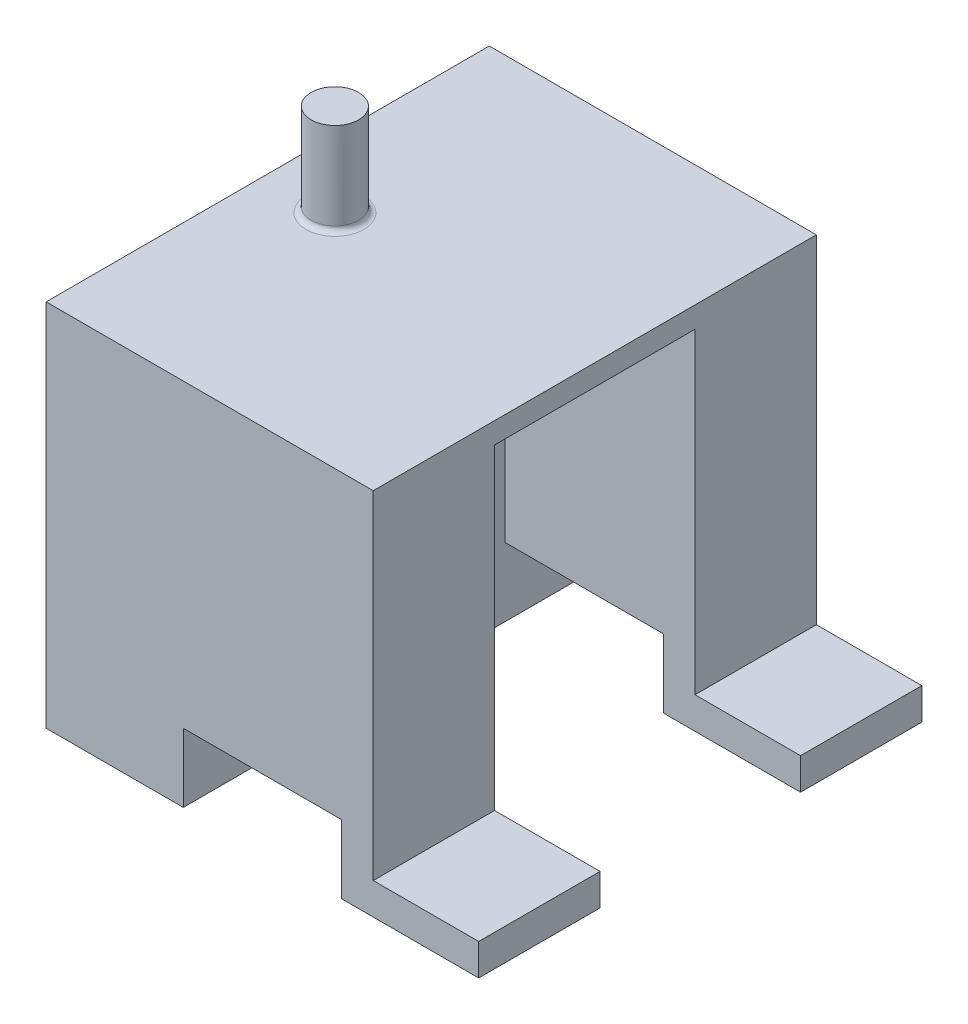
ISO-10303-21;
HEADER;
FILE_DESCRIPTION(('STEP AP214'),'2;1');
FILE_NAME('part.step','',(''),(''),'','','');
FILE_SCHEMA(('AUTOMOTIVE_DESIGN { 1 0 10303 214 1 1 1 1 }'));
ENDSEC;
DATA;
#1=APPLICATION_CONTEXT('core data for automotive mechanical design processes');
#2=APPLICATION_PROTOCOL_DEFINITION('international standard','automotive_design',2000,#1);
#3=PRODUCT_CONTEXT('',#1,'mechanical');
#4=PRODUCT('Part','Part','',(#3));
#5=PRODUCT_RELATED_PRODUCT_CATEGORY('part','',(#4));
#6=PRODUCT_DEFINITION_FORMATION('','',#4);
#7=PRODUCT_DEFINITION_CONTEXT('part definition',#1,'design');
#8=PRODUCT_DEFINITION('design','',#6,#7);
#9=PRODUCT_DEFINITION_SHAPE('','',#8);
#10=(LENGTH_UNIT() NAMED_UNIT(*) SI_UNIT(.MILLI.,.METRE.));
#11=(NAMED_UNIT(*) PLANE_ANGLE_UNIT() SI_UNIT($,.RADIAN.));
#12=(NAMED_UNIT(*) SI_UNIT($,.STERADIAN.) SOLID_ANGLE_UNIT());
#13=UNCERTAINTY_MEASURE_WITH_UNIT(LENGTH_MEASURE(1.E-05),#10,'distance_accuracy_value','');
#14=(GEOMETRIC_REPRESENTATION_CONTEXT(3) GLOBAL_UNCERTAINTY_ASSIGNED_CONTEXT((#13)) GLOBAL_UNIT_ASSIGNED_CONTEXT((#10,
#11,#12)) REPRESENTATION_CONTEXT('',''));
#15=CARTESIAN_POINT('',(0.,0.,0.));
#16=DIRECTION('',(0.,0.,1.));
#17=DIRECTION('',(1.,0.,0.));
#18=AXIS2_PLACEMENT_3D('',#15,#16,#17);
#19=CARTESIAN_POINT('',(19.5806451612903,0.,42.));
#20=DIRECTION('',(0.,1.,0.));
#21=DIRECTION('',(0.,0.,1.));
#22=AXIS2_PLACEMENT_3D('',#19,#20,#21);
#23=PLANE('',#22);
#24=DIRECTION('',(0.,0.,-1.));
#25=VECTOR('',#24,1.);
#26=CARTESIAN_POINT('',(19.5806451612903,0.,42.));
#27=LINE('',#26,#25);
#28=CARTESIAN_POINT('',(19.5806451612903,0.,42.));
#29=VERTEX_POINT('',#28);
#30=CARTESIAN_POINT('',(19.5806451612903,0.,30.5));
#31=VERTEX_POINT('',#30);
#32=EDGE_CURVE('E211',#29,#31,#27,.T.);
#33=ORIENTED_EDGE('',*,*,#32,.T.);
#34=DIRECTION('',(1.,0.,0.));
#35=VECTOR('',#34,1.);
#36=CARTESIAN_POINT('',(-33.4982203680293,0.,30.5));
#37=LINE('',#36,#35);
#38=CARTESIAN_POINT('',(32.5806451612903,0.,30.5));
#39=VERTEX_POINT('',#38);
#40=EDGE_CURVE('E410',#31,#39,#37,.T.);
#41=ORIENTED_EDGE('',*,*,#40,.T.);
#42=DIRECTION('',(0.,0.,-1.));
#43=VECTOR('',#42,1.);
#44=CARTESIAN_POINT('',(32.5806451612903,0.,42.));
#45=LINE('',#44,#43);
#46=CARTESIAN_POINT('',(32.5806451612903,0.,42.));
#47=VERTEX_POINT('',#46);
#48=EDGE_CURVE('E243',#47,#39,#45,.T.);
#49=ORIENTED_EDGE('',*,*,#48,.F.);
#50=DIRECTION('',(1.,0.,0.));
#51=VECTOR('',#50,1.);
#52=CARTESIAN_POINT('',(19.5806451612903,0.,42.));
#53=LINE('',#52,#51);
#54=EDGE_CURVE('E210',#29,#47,#53,.T.);
#55=ORIENTED_EDGE('',*,*,#54,.F.);
#56=EDGE_LOOP('',(#33,#41,#49,#55));
#57=FACE_BOUND('',#56,.T.);
#58=ADVANCED_FACE('F41',(#57),#23,.F.);
#59=CARTESIAN_POINT('',(32.5806451612903,0.,42.));
#60=DIRECTION('',(-1.,0.,0.));
#61=DIRECTION('',(0.,0.,1.));
#62=AXIS2_PLACEMENT_3D('',#59,#60,#61);
#63=PLANE('',#62);
#64=ORIENTED_EDGE('',*,*,#48,.T.);
#65=DIRECTION('',(0.,-1.,0.));
#66=VECTOR('',#65,1.);
#67=CARTESIAN_POINT('',(32.5806451612903,0.,30.5));
#68=LINE('',#67,#66);
#69=CARTESIAN_POINT('',(32.5806451612903,3.,30.5));
#70=VERTEX_POINT('',#69);
#71=EDGE_CURVE('E420',#70,#39,#68,.T.);
#72=ORIENTED_EDGE('',*,*,#71,.F.);
#73=DIRECTION('',(0.,0.,-1.));
#74=VECTOR('',#73,1.);
#75=CARTESIAN_POINT('',(32.5806451612903,3.,42.));
#76=LINE('',#75,#74);
#77=CARTESIAN_POINT('',(32.5806451612903,3.,42.));
#78=VERTEX_POINT('',#77);
#79=EDGE_CURVE('E238',#78,#70,#76,.T.);
#80=ORIENTED_EDGE('',*,*,#79,.F.);
#81=DIRECTION('',(0.,1.,0.));
#82=VECTOR('',#81,1.);
#83=CARTESIAN_POINT('',(32.5806451612903,0.,42.));
#84=LINE('',#83,#82);
#85=EDGE_CURVE('E115',#47,#78,#84,.T.);
#86=ORIENTED_EDGE('',*,*,#85,.F.);
#87=EDGE_LOOP('',(#64,#72,#80,#86));
#88=FACE_BOUND('',#87,.T.);
#89=ADVANCED_FACE('F273',(#88),#63,.F.);
#90=CARTESIAN_POINT('',(32.5806451612903,3.,42.));
#91=DIRECTION('',(0.,-1.,0.));
#92=DIRECTION('',(1.,0.,0.));
#93=AXIS2_PLACEMENT_3D('',#90,#91,#92);
#94=PLANE('',#93);
#95=ORIENTED_EDGE('',*,*,#79,.T.);
#96=DIRECTION('',(-1.,0.,0.));
#97=VECTOR('',#96,1.);
#98=CARTESIAN_POINT('',(32.5806451612903,3.,30.5));
#99=LINE('',#98,#97);
#100=CARTESIAN_POINT('',(22.5806451612903,3.,30.5));
#101=VERTEX_POINT('',#100);
#102=EDGE_CURVE('E176',#70,#101,#99,.T.);
#103=ORIENTED_EDGE('',*,*,#102,.T.);
#104=DIRECTION('',(0.,0.,-1.));
#105=VECTOR('',#104,1.);
#106=CARTESIAN_POINT('',(22.5806451612903,3.,42.));
#107=LINE('',#106,#105);
#108=CARTESIAN_POINT('',(22.5806451612903,3.,42.));
#109=VERTEX_POINT('',#108);
#110=EDGE_CURVE('E233',#109,#101,#107,.T.);
#111=ORIENTED_EDGE('',*,*,#110,.F.);
#112=DIRECTION('',(-1.,0.,0.));
#113=VECTOR('',#112,1.);
#114=CARTESIAN_POINT('',(32.5806451612903,3.,42.));
#115=LINE('',#114,#113);
#116=EDGE_CURVE('E355',#78,#109,#115,.T.);
#117=ORIENTED_EDGE('',*,*,#116,.F.);
#118=EDGE_LOOP('',(#95,#103,#111,#117));
#119=FACE_BOUND('',#118,.T.);
#120=ADVANCED_FACE('F279',(#119),#94,.F.);
#121=CARTESIAN_POINT('',(19.5806451612903,6.5,42.));
#122=DIRECTION('',(0.,1.,0.));
#123=DIRECTION('',(-1.,0.,0.));
#124=AXIS2_PLACEMENT_3D('',#121,#122,#123);
#125=PLANE('',#124);
#126=DIRECTION('',(0.,0.,-1.));
#127=VECTOR('',#126,1.);
#128=CARTESIAN_POINT('',(4.58064516129029,6.5,42.));
#129=LINE('',#128,#127);
#130=CARTESIAN_POINT('',(4.58064516129029,6.5,42.));
#131=VERTEX_POINT('',#130);
#132=CARTESIAN_POINT('',(4.58064516129029,6.5,30.5));
#133=VERTEX_POINT('',#132);
#134=EDGE_CURVE('E150',#131,#133,#129,.T.);
#135=ORIENTED_EDGE('',*,*,#134,.T.);
#136=DIRECTION('',(1.,0.,0.));
#137=VECTOR('',#136,1.);
#138=CARTESIAN_POINT('',(19.5806451612903,6.5,30.5));
#139=LINE('',#138,#137);
#140=CARTESIAN_POINT('',(19.5806451612903,6.5,30.5));
#141=VERTEX_POINT('',#140);
#142=EDGE_CURVE('E335',#133,#141,#139,.T.);
#143=ORIENTED_EDGE('',*,*,#142,.T.);
#144=DIRECTION('',(0.,0.,-1.));
#145=VECTOR('',#144,1.);
#146=CARTESIAN_POINT('',(19.5806451612903,6.5,42.));
#147=LINE('',#146,#145);
#148=CARTESIAN_POINT('',(19.5806451612903,6.5,42.));
#149=VERTEX_POINT('',#148);
#150=EDGE_CURVE('E165',#149,#141,#147,.T.);
#151=ORIENTED_EDGE('',*,*,#150,.F.);
#152=DIRECTION('',(1.,0.,0.));
#153=VECTOR('',#152,1.);
#154=CARTESIAN_POINT('',(19.5806451612903,6.5,42.));
#155=LINE('',#154,#153);
#156=EDGE_CURVE('E140',#131,#149,#155,.T.);
#157=ORIENTED_EDGE('',*,*,#156,.F.);
#158=EDGE_LOOP('',(#135,#143,#151,#157));
#159=FACE_BOUND('',#158,.T.);
#160=ADVANCED_FACE('F163',(#159),#125,.F.);
#161=CARTESIAN_POINT('',(19.5806451612903,0.,42.));
#162=DIRECTION('',(1.,0.,0.));
#163=DIRECTION('',(0.,1.,0.));
#164=AXIS2_PLACEMENT_3D('',#161,#162,#163);
#165=PLANE('',#164);
#166=ORIENTED_EDGE('',*,*,#150,.T.);
#167=DIRECTION('',(0.,-1.,0.));
#168=VECTOR('',#167,1.);
#169=CARTESIAN_POINT('',(19.5806451612903,0.,30.5));
#170=LINE('',#169,#168);
#171=EDGE_CURVE('E249',#141,#31,#170,.T.);
#172=ORIENTED_EDGE('',*,*,#171,.T.);
#173=ORIENTED_EDGE('',*,*,#32,.F.);
#174=DIRECTION('',(0.,-1.,0.));
#175=VECTOR('',#174,1.);
#176=CARTESIAN_POINT('',(19.5806451612903,0.,42.));
#177=LINE('',#176,#175);
#178=EDGE_CURVE('E66',#149,#29,#177,.T.);
#179=ORIENTED_EDGE('',*,*,#178,.F.);
#180=EDGE_LOOP('',(#166,#172,#173,#179));
#181=FACE_BOUND('',#180,.T.);
#182=ADVANCED_FACE('F283',(#181),#165,.F.);
#183=CARTESIAN_POINT('',(32.5806451612903,0.,11.5));
#184=VERTEX_POINT('',#183);
#185=CARTESIAN_POINT('',(32.5806451612903,0.,0.));
#186=VERTEX_POINT('',#185);
#187=EDGE_CURVE('E242',#184,#186,#45,.T.);
#188=ORIENTED_EDGE('',*,*,#187,.F.);
#189=DIRECTION('',(1.,0.,0.));
#190=VECTOR('',#189,1.);
#191=CARTESIAN_POINT('',(-33.4982203680293,0.,11.5));
#192=LINE('',#191,#190);
#193=CARTESIAN_POINT('',(19.5806451612903,0.,11.5));
#194=VERTEX_POINT('',#193);
#195=EDGE_CURVE('E297',#194,#184,#192,.T.);
#196=ORIENTED_EDGE('',*,*,#195,.F.);
#197=CARTESIAN_POINT('',(19.5806451612903,0.,0.));
#198=VERTEX_POINT('',#197);
#199=EDGE_CURVE('E106',#194,#198,#27,.T.);
#200=ORIENTED_EDGE('',*,*,#199,.T.);
#201=DIRECTION('',(1.,0.,0.));
#202=VECTOR('',#201,1.);
#203=CARTESIAN_POINT('',(19.5806451612903,0.,0.));
#204=LINE('',#203,#202);
#205=EDGE_CURVE('E172',#198,#186,#204,.T.);
#206=ORIENTED_EDGE('',*,*,#205,.T.);
#207=EDGE_LOOP('',(#188,#196,#200,#206));
#208=FACE_BOUND('',#207,.T.);
#209=ADVANCED_FACE('F275',(#208),#23,.F.);
#210=CARTESIAN_POINT('',(32.5806451612903,3.,11.5));
#211=VERTEX_POINT('',#210);
#212=CARTESIAN_POINT('',(32.5806451612903,3.,0.));
#213=VERTEX_POINT('',#212);
#214=EDGE_CURVE('E237',#211,#213,#76,.T.);
#215=ORIENTED_EDGE('',*,*,#214,.F.);
#216=DIRECTION('',(0.,1.,0.));
#217=VECTOR('',#216,1.);
#218=CARTESIAN_POINT('',(32.5806451612903,0.,11.5));
#219=LINE('',#218,#217);
#220=EDGE_CURVE('E323',#184,#211,#219,.T.);
#221=ORIENTED_EDGE('',*,*,#220,.F.);
#222=ORIENTED_EDGE('',*,*,#187,.T.);
#223=DIRECTION('',(0.,1.,0.));
#224=VECTOR('',#223,1.);
#225=CARTESIAN_POINT('',(32.5806451612903,0.,0.));
#226=LINE('',#225,#224);
#227=EDGE_CURVE('E175',#186,#213,#226,.T.);
#228=ORIENTED_EDGE('',*,*,#227,.T.);
#229=EDGE_LOOP('',(#215,#221,#222,#228));
#230=FACE_BOUND('',#229,.T.);
#231=ADVANCED_FACE('F281',(#230),#63,.F.);
#232=CARTESIAN_POINT('',(22.5806451612903,3.,11.5));
#233=VERTEX_POINT('',#232);
#234=CARTESIAN_POINT('',(22.5806451612903,3.,0.));
#235=VERTEX_POINT('',#234);
#236=EDGE_CURVE('E232',#233,#235,#107,.T.);
#237=ORIENTED_EDGE('',*,*,#236,.F.);
#238=DIRECTION('',(1.,0.,0.));
#239=VECTOR('',#238,1.);
#240=CARTESIAN_POINT('',(32.5806451612903,3.,11.5));
#241=LINE('',#240,#239);
#242=EDGE_CURVE('E331',#233,#211,#241,.T.);
#243=ORIENTED_EDGE('',*,*,#242,.T.);
#244=ORIENTED_EDGE('',*,*,#214,.T.);
#245=DIRECTION('',(-1.,0.,0.));
#246=VECTOR('',#245,1.);
#247=CARTESIAN_POINT('',(32.5806451612903,3.,0.));
#248=LINE('',#247,#246);
#249=EDGE_CURVE('E180',#213,#235,#248,.T.);
#250=ORIENTED_EDGE('',*,*,#249,.T.);
#251=EDGE_LOOP('',(#237,#243,#244,#250));
#252=FACE_BOUND('',#251,.T.);
#253=ADVANCED_FACE('F288',(#252),#94,.F.);
#254=CARTESIAN_POINT('',(22.5806451612903,35.,42.));
#255=DIRECTION('',(-1.,0.,0.));
#256=DIRECTION('',(0.,-1.,0.));
#257=AXIS2_PLACEMENT_3D('',#254,#255,#256);
#258=PLANE('',#257);
#259=ORIENTED_EDGE('',*,*,#110,.T.);
#260=DIRECTION('',(0.,1.,0.));
#261=VECTOR('',#260,1.);
#262=CARTESIAN_POINT('',(22.5806451612903,35.,30.5));
#263=LINE('',#262,#261);
#264=CARTESIAN_POINT('',(22.5806451612903,33.,30.5));
#265=VERTEX_POINT('',#264);
#266=EDGE_CURVE('E340',#101,#265,#263,.T.);
#267=ORIENTED_EDGE('',*,*,#266,.T.);
#268=DIRECTION('',(0.,0.,-1.));
#269=VECTOR('',#268,1.);
#270=CARTESIAN_POINT('',(22.5806451612903,33.,42.));
#271=LINE('',#270,#269);
#272=CARTESIAN_POINT('',(22.5806451612903,33.,11.5));
#273=VERTEX_POINT('',#272);
#274=EDGE_CURVE('E253',#265,#273,#271,.T.);
#275=ORIENTED_EDGE('',*,*,#274,.T.);
#276=DIRECTION('',(0.,-1.,0.));
#277=VECTOR('',#276,1.);
#278=CARTESIAN_POINT('',(22.5806451612903,35.,11.5));
#279=LINE('',#278,#277);
#280=EDGE_CURVE('E336',#273,#233,#279,.T.);
#281=ORIENTED_EDGE('',*,*,#280,.T.);
#282=ORIENTED_EDGE('',*,*,#236,.T.);
#283=DIRECTION('',(0.,1.,0.));
#284=VECTOR('',#283,1.);
#285=CARTESIAN_POINT('',(22.5806451612903,35.,0.));
#286=LINE('',#285,#284);
#287=CARTESIAN_POINT('',(22.5806451612903,35.,0.));
#288=VERTEX_POINT('',#287);
#289=EDGE_CURVE('E184',#235,#288,#286,.T.);
#290=ORIENTED_EDGE('',*,*,#289,.T.);
#291=DIRECTION('',(0.,0.,-1.));
#292=VECTOR('',#291,1.);
#293=CARTESIAN_POINT('',(22.5806451612903,35.,42.));
#294=LINE('',#293,#292);
#295=CARTESIAN_POINT('',(22.5806451612903,35.,42.));
#296=VERTEX_POINT('',#295);
#297=EDGE_CURVE('E228',#296,#288,#294,.T.);
#298=ORIENTED_EDGE('',*,*,#297,.F.);
#299=DIRECTION('',(0.,1.,0.));
#300=VECTOR('',#299,1.);
#301=CARTESIAN_POINT('',(22.5806451612903,35.,42.));
#302=LINE('',#301,#300);
#303=EDGE_CURVE('E358',#109,#296,#302,.T.);
#304=ORIENTED_EDGE('',*,*,#303,.F.);
#305=EDGE_LOOP('',(#259,#267,#275,#281,#282,#290,#298,#304));
#306=FACE_BOUND('',#305,.T.);
#307=ADVANCED_FACE('F383',(#306),#258,.F.);
#308=CARTESIAN_POINT('',(-8.41935483870971,35.,42.));
#309=DIRECTION('',(0.,-1.,0.));
#310=DIRECTION('',(0.,0.,-1.));
#311=AXIS2_PLACEMENT_3D('',#308,#309,#310);
#312=PLANE('',#311);
#313=CARTESIAN_POINT('',(-2.05170736498403,35.,21.));
#314=DIRECTION('',(0.,-1.,0.));
#315=DIRECTION('',(0.,0.,-1.));
#316=AXIS2_PLACEMENT_3D('',#313,#314,#315);
#317=CIRCLE('',#316,2.75);
#318=CARTESIAN_POINT('',(-2.05170736498403,35.,18.25));
#319=VERTEX_POINT('',#318);
#320=EDGE_CURVE('E11',#319,#319,#317,.T.);
#321=ORIENTED_EDGE('',*,*,#320,.T.);
#322=EDGE_LOOP('',(#321));
#323=FACE_BOUND('',#322,.T.);
#324=DIRECTION('',(-1.,0.,0.));
#325=VECTOR('',#324,1.);
#326=CARTESIAN_POINT('',(-8.41935483870971,35.,0.));
#327=LINE('',#326,#325);
#328=CARTESIAN_POINT('',(-8.41935483870971,35.,0.));
#329=VERTEX_POINT('',#328);
#330=EDGE_CURVE('E188',#288,#329,#327,.T.);
#331=ORIENTED_EDGE('',*,*,#330,.T.);
#332=DIRECTION('',(0.,0.,-1.));
#333=VECTOR('',#332,1.);
#334=CARTESIAN_POINT('',(-8.41935483870971,35.,42.));
#335=LINE('',#334,#333);
#336=CARTESIAN_POINT('',(-8.41935483870971,35.,42.));
#337=VERTEX_POINT('',#336);
#338=EDGE_CURVE('E224',#337,#329,#335,.T.);
#339=ORIENTED_EDGE('',*,*,#338,.F.);
#340=DIRECTION('',(-1.,0.,0.));
#341=VECTOR('',#340,1.);
#342=CARTESIAN_POINT('',(1.58064516129029,35.,42.));
#343=LINE('',#342,#341);
#344=EDGE_CURVE('E361',#296,#337,#343,.T.);
#345=ORIENTED_EDGE('',*,*,#344,.F.);
#346=ORIENTED_EDGE('',*,*,#297,.T.);
#347=EDGE_LOOP('',(#331,#339,#345,#346));
#348=FACE_BOUND('',#347,.T.);
#349=ADVANCED_FACE('F379',(#323,#348),#312,.F.);
#350=CARTESIAN_POINT('',(-8.41935483870971,0.,42.));
#351=DIRECTION('',(1.,0.,0.));
#352=DIRECTION('',(0.,0.,-1.));
#353=AXIS2_PLACEMENT_3D('',#350,#351,#352);
#354=PLANE('',#353);
#355=DIRECTION('',(0.,-1.,0.));
#356=VECTOR('',#355,1.);
#357=CARTESIAN_POINT('',(-8.41935483870971,0.,0.));
#358=LINE('',#357,#356);
#359=CARTESIAN_POINT('',(-8.41935483870971,0.,0.));
#360=VERTEX_POINT('',#359);
#361=EDGE_CURVE('E192',#329,#360,#358,.T.);
#362=ORIENTED_EDGE('',*,*,#361,.T.);
#363=DIRECTION('',(0.,0.,-1.));
#364=VECTOR('',#363,1.);
#365=CARTESIAN_POINT('',(-8.41935483870971,0.,42.));
#366=LINE('',#365,#364);
#367=CARTESIAN_POINT('',(-8.41935483870971,0.,42.));
#368=VERTEX_POINT('',#367);
#369=EDGE_CURVE('E220',#368,#360,#366,.T.);
#370=ORIENTED_EDGE('',*,*,#369,.F.);
#371=DIRECTION('',(0.,-1.,0.));
#372=VECTOR('',#371,1.);
#373=CARTESIAN_POINT('',(-8.41935483870971,3.,42.));
#374=LINE('',#373,#372);
#375=EDGE_CURVE('E364',#337,#368,#374,.T.);
#376=ORIENTED_EDGE('',*,*,#375,.F.);
#377=ORIENTED_EDGE('',*,*,#338,.T.);
#378=EDGE_LOOP('',(#362,#370,#376,#377));
#379=FACE_BOUND('',#378,.T.);
#380=ADVANCED_FACE('F372',(#379),#354,.F.);
#381=CARTESIAN_POINT('',(4.58064516129029,0.,42.));
#382=DIRECTION('',(0.,1.,0.));
#383=DIRECTION('',(-1.,0.,0.));
#384=AXIS2_PLACEMENT_3D('',#381,#382,#383);
#385=PLANE('',#384);
#386=DIRECTION('',(1.,0.,0.));
#387=VECTOR('',#386,1.);
#388=CARTESIAN_POINT('',(4.58064516129029,0.,0.));
#389=LINE('',#388,#387);
#390=CARTESIAN_POINT('',(4.58064516129029,0.,0.));
#391=VERTEX_POINT('',#390);
#392=EDGE_CURVE('E195',#360,#391,#389,.T.);
#393=ORIENTED_EDGE('',*,*,#392,.T.);
#394=DIRECTION('',(0.,0.,-1.));
#395=VECTOR('',#394,1.);
#396=CARTESIAN_POINT('',(4.58064516129029,0.,42.));
#397=LINE('',#396,#395);
#398=CARTESIAN_POINT('',(4.58064516129029,0.,42.));
#399=VERTEX_POINT('',#398);
#400=EDGE_CURVE('E160',#399,#391,#397,.T.);
#401=ORIENTED_EDGE('',*,*,#400,.F.);
#402=DIRECTION('',(1.,0.,0.));
#403=VECTOR('',#402,1.);
#404=CARTESIAN_POINT('',(4.58064516129029,0.,42.));
#405=LINE('',#404,#403);
#406=EDGE_CURVE('E143',#368,#399,#405,.T.);
#407=ORIENTED_EDGE('',*,*,#406,.F.);
#408=ORIENTED_EDGE('',*,*,#369,.T.);
#409=EDGE_LOOP('',(#393,#401,#407,#408));
#410=FACE_BOUND('',#409,.T.);
#411=ADVANCED_FACE('F375',(#410),#385,.F.);
#412=CARTESIAN_POINT('',(4.58064516129029,6.5,42.));
#413=DIRECTION('',(-1.,0.,0.));
#414=DIRECTION('',(0.,0.,1.));
#415=AXIS2_PLACEMENT_3D('',#412,#413,#414);
#416=PLANE('',#415);
#417=CARTESIAN_POINT('',(4.58064516129029,6.5,11.5));
#418=VERTEX_POINT('',#417);
#419=CARTESIAN_POINT('',(4.58064516129029,6.5,0.));
#420=VERTEX_POINT('',#419);
#421=EDGE_CURVE('E161',#418,#420,#129,.T.);
#422=ORIENTED_EDGE('',*,*,#421,.F.);
#423=DIRECTION('',(0.,1.,0.));
#424=VECTOR('',#423,1.);
#425=CARTESIAN_POINT('',(4.58064516129029,0.,11.5));
#426=LINE('',#425,#424);
#427=CARTESIAN_POINT('',(4.58064516129029,33.,11.5));
#428=VERTEX_POINT('',#427);
#429=EDGE_CURVE('E401',#418,#428,#426,.T.);
#430=ORIENTED_EDGE('',*,*,#429,.T.);
#431=DIRECTION('',(0.,0.,1.));
#432=VECTOR('',#431,1.);
#433=CARTESIAN_POINT('',(4.58064516129029,33.,11.5));
#434=LINE('',#433,#432);
#435=CARTESIAN_POINT('',(4.58064516129029,33.,30.5));
#436=VERTEX_POINT('',#435);
#437=EDGE_CURVE('E399',#428,#436,#434,.T.);
#438=ORIENTED_EDGE('',*,*,#437,.T.);
#439=DIRECTION('',(0.,-1.,0.));
#440=VECTOR('',#439,1.);
#441=CARTESIAN_POINT('',(4.58064516129029,0.,30.5));
#442=LINE('',#441,#440);
#443=EDGE_CURVE('E156',#436,#133,#442,.T.);
#444=ORIENTED_EDGE('',*,*,#443,.T.);
#445=ORIENTED_EDGE('',*,*,#134,.F.);
#446=DIRECTION('',(0.,1.,0.));
#447=VECTOR('',#446,1.);
#448=CARTESIAN_POINT('',(4.58064516129029,6.5,42.));
#449=LINE('',#448,#447);
#450=EDGE_CURVE('E136',#399,#131,#449,.T.);
#451=ORIENTED_EDGE('',*,*,#450,.F.);
#452=ORIENTED_EDGE('',*,*,#400,.T.);
#453=DIRECTION('',(0.,1.,0.));
#454=VECTOR('',#453,1.);
#455=CARTESIAN_POINT('',(4.58064516129029,6.5,0.));
#456=LINE('',#455,#454);
#457=EDGE_CURVE('E199',#391,#420,#456,.T.);
#458=ORIENTED_EDGE('',*,*,#457,.T.);
#459=EDGE_LOOP('',(#422,#430,#438,#444,#445,#451,#452,#458));
#460=FACE_BOUND('',#459,.T.);
#461=ADVANCED_FACE('F152',(#460),#416,.F.);
#462=CARTESIAN_POINT('',(19.5806451612903,6.5,11.5));
#463=VERTEX_POINT('',#462);
#464=CARTESIAN_POINT('',(19.5806451612903,6.5,0.));
#465=VERTEX_POINT('',#464);
#466=EDGE_CURVE('E215',#463,#465,#147,.T.);
#467=ORIENTED_EDGE('',*,*,#466,.F.);
#468=DIRECTION('',(-1.,0.,0.));
#469=VECTOR('',#468,1.);
#470=CARTESIAN_POINT('',(19.5806451612903,6.5,11.5));
#471=LINE('',#470,#469);
#472=EDGE_CURVE('E57',#463,#418,#471,.T.);
#473=ORIENTED_EDGE('',*,*,#472,.T.);
#474=ORIENTED_EDGE('',*,*,#421,.T.);
#475=DIRECTION('',(1.,0.,0.));
#476=VECTOR('',#475,1.);
#477=CARTESIAN_POINT('',(19.5806451612903,6.5,0.));
#478=LINE('',#477,#476);
#479=EDGE_CURVE('E203',#420,#465,#478,.T.);
#480=ORIENTED_EDGE('',*,*,#479,.T.);
#481=EDGE_LOOP('',(#467,#473,#474,#480));
#482=FACE_BOUND('',#481,.T.);
#483=ADVANCED_FACE('F314',(#482),#125,.F.);
#484=ORIENTED_EDGE('',*,*,#199,.F.);
#485=DIRECTION('',(0.,1.,0.));
#486=VECTOR('',#485,1.);
#487=CARTESIAN_POINT('',(19.5806451612903,0.,11.5));
#488=LINE('',#487,#486);
#489=EDGE_CURVE('E246',#194,#463,#488,.T.);
#490=ORIENTED_EDGE('',*,*,#489,.T.);
#491=ORIENTED_EDGE('',*,*,#466,.T.);
#492=DIRECTION('',(0.,-1.,0.));
#493=VECTOR('',#492,1.);
#494=CARTESIAN_POINT('',(19.5806451612903,0.,0.));
#495=LINE('',#494,#493);
#496=EDGE_CURVE('E207',#465,#198,#495,.T.);
#497=ORIENTED_EDGE('',*,*,#496,.T.);
#498=EDGE_LOOP('',(#484,#490,#491,#497));
#499=FACE_BOUND('',#498,.T.);
#500=ADVANCED_FACE('F292',(#499),#165,.F.);
#501=CARTESIAN_POINT('',(0.,0.,42.));
#502=DIRECTION('',(0.,0.,1.));
#503=DIRECTION('',(1.,0.,0.));
#504=AXIS2_PLACEMENT_3D('',#501,#502,#503);
#505=PLANE('',#504);
#506=ORIENTED_EDGE('',*,*,#54,.T.);
#507=ORIENTED_EDGE('',*,*,#85,.T.);
#508=ORIENTED_EDGE('',*,*,#116,.T.);
#509=ORIENTED_EDGE('',*,*,#303,.T.);
#510=ORIENTED_EDGE('',*,*,#344,.T.);
#511=ORIENTED_EDGE('',*,*,#375,.T.);
#512=ORIENTED_EDGE('',*,*,#406,.T.);
#513=ORIENTED_EDGE('',*,*,#450,.T.);
#514=ORIENTED_EDGE('',*,*,#156,.T.);
#515=ORIENTED_EDGE('',*,*,#178,.T.);
#516=EDGE_LOOP('',(#506,#507,#508,#509,#510,#511,#512,#513,#514,#515));
#517=FACE_BOUND('',#516,.T.);
#518=ADVANCED_FACE('F138',(#517),#505,.T.);
#519=CARTESIAN_POINT('',(0.,0.,0.));
#520=DIRECTION('',(0.,0.,1.));
#521=DIRECTION('',(1.,0.,0.));
#522=AXIS2_PLACEMENT_3D('',#519,#520,#521);
#523=PLANE('',#522);
#524=ORIENTED_EDGE('',*,*,#205,.F.);
#525=ORIENTED_EDGE('',*,*,#496,.F.);
#526=ORIENTED_EDGE('',*,*,#479,.F.);
#527=ORIENTED_EDGE('',*,*,#457,.F.);
#528=ORIENTED_EDGE('',*,*,#392,.F.);
#529=ORIENTED_EDGE('',*,*,#361,.F.);
#530=ORIENTED_EDGE('',*,*,#330,.F.);
#531=ORIENTED_EDGE('',*,*,#289,.F.);
#532=ORIENTED_EDGE('',*,*,#249,.F.);
#533=ORIENTED_EDGE('',*,*,#227,.F.);
#534=EDGE_LOOP('',(#524,#525,#526,#527,#528,#529,#530,#531,#532,#533));
#535=FACE_BOUND('',#534,.T.);
#536=ADVANCED_FACE('F317',(#535),#523,.F.);
#537=CARTESIAN_POINT('',(-33.4982203680293,33.,11.5));
#538=DIRECTION('',(0.,1.,0.));
#539=DIRECTION('',(0.,0.,1.));
#540=AXIS2_PLACEMENT_3D('',#537,#538,#539);
#541=PLANE('',#540);
#542=DIRECTION('',(1.,0.,0.));
#543=VECTOR('',#542,1.);
#544=CARTESIAN_POINT('',(-33.4982203680293,33.,30.5));
#545=LINE('',#544,#543);
#546=EDGE_CURVE('E407',#436,#265,#545,.T.);
#547=ORIENTED_EDGE('',*,*,#546,.F.);
#548=ORIENTED_EDGE('',*,*,#437,.F.);
#549=DIRECTION('',(1.,0.,0.));
#550=VECTOR('',#549,1.);
#551=CARTESIAN_POINT('',(-33.4982203680293,33.,11.5));
#552=LINE('',#551,#550);
#553=EDGE_CURVE('E391',#428,#273,#552,.T.);
#554=ORIENTED_EDGE('',*,*,#553,.T.);
#555=ORIENTED_EDGE('',*,*,#274,.F.);
#556=EDGE_LOOP('',(#547,#548,#554,#555));
#557=FACE_BOUND('',#556,.T.);
#558=ADVANCED_FACE('F396',(#557),#541,.F.);
#559=CARTESIAN_POINT('',(-33.4982203680293,0.,30.5));
#560=DIRECTION('',(0.,0.,1.));
#561=DIRECTION('',(0.,-1.,0.));
#562=AXIS2_PLACEMENT_3D('',#559,#560,#561);
#563=PLANE('',#562);
#564=ORIENTED_EDGE('',*,*,#71,.T.);
#565=ORIENTED_EDGE('',*,*,#40,.F.);
#566=ORIENTED_EDGE('',*,*,#171,.F.);
#567=ORIENTED_EDGE('',*,*,#142,.F.);
#568=ORIENTED_EDGE('',*,*,#443,.F.);
#569=ORIENTED_EDGE('',*,*,#546,.T.);
#570=ORIENTED_EDGE('',*,*,#266,.F.);
#571=ORIENTED_EDGE('',*,*,#102,.F.);
#572=EDGE_LOOP('',(#564,#565,#566,#567,#568,#569,#570,#571));
#573=FACE_BOUND('',#572,.T.);
#574=ADVANCED_FACE('F435',(#573),#563,.F.);
#575=CARTESIAN_POINT('',(-33.4982203680293,0.,11.5));
#576=DIRECTION('',(0.,0.,-1.));
#577=DIRECTION('',(-1.,0.,0.));
#578=AXIS2_PLACEMENT_3D('',#575,#576,#577);
#579=PLANE('',#578);
#580=ORIENTED_EDGE('',*,*,#280,.F.);
#581=ORIENTED_EDGE('',*,*,#553,.F.);
#582=ORIENTED_EDGE('',*,*,#429,.F.);
#583=ORIENTED_EDGE('',*,*,#472,.F.);
#584=ORIENTED_EDGE('',*,*,#489,.F.);
#585=ORIENTED_EDGE('',*,*,#195,.T.);
#586=ORIENTED_EDGE('',*,*,#220,.T.);
#587=ORIENTED_EDGE('',*,*,#242,.F.);
#588=EDGE_LOOP('',(#580,#581,#582,#583,#584,#585,#586,#587));
#589=FACE_BOUND('',#588,.T.);
#590=ADVANCED_FACE('F389',(#589),#579,.F.);
#591=CARTESIAN_POINT('',(-2.05170736498403,43.75,21.));
#592=DIRECTION('',(0.,-1.,0.));
#593=DIRECTION('',(0.,0.,-1.));
#594=AXIS2_PLACEMENT_3D('',#591,#592,#593);
#595=CYLINDRICAL_SURFACE('',#594,2.25);
#596=CARTESIAN_POINT('',(-2.05170736498403,35.5,21.));
#597=DIRECTION('',(0.,-1.,0.));
#598=DIRECTION('',(0.,0.,-1.));
#599=AXIS2_PLACEMENT_3D('',#596,#597,#598);
#600=CIRCLE('',#599,2.25);
#601=CARTESIAN_POINT('',(-2.05170736498403,35.5,18.75));
#602=VERTEX_POINT('',#601);
#603=EDGE_CURVE('E50',#602,#602,#600,.F.);
#604=ORIENTED_EDGE('',*,*,#603,.T.);
#605=EDGE_LOOP('',(#604));
#606=FACE_BOUND('',#605,.T.);
#607=CARTESIAN_POINT('',(-2.05170736498403,43.75,21.));
#608=DIRECTION('',(0.,1.,0.));
#609=DIRECTION('',(0.,0.,1.));
#610=AXIS2_PLACEMENT_3D('',#607,#608,#609);
#611=CIRCLE('',#610,2.25);
#612=CARTESIAN_POINT('',(-2.05170736498403,43.75,23.25));
#613=VERTEX_POINT('',#612);
#614=EDGE_CURVE('E423',#613,#613,#611,.T.);
#615=ORIENTED_EDGE('',*,*,#614,.F.);
#616=EDGE_LOOP('',(#615));
#617=FACE_BOUND('',#616,.T.);
#618=ADVANCED_FACE('F260',(#606,#617),#595,.T.);
#619=CARTESIAN_POINT('',(-2.05170736498403,43.75,21.));
#620=DIRECTION('',(0.,1.,0.));
#621=DIRECTION('',(0.,0.,1.));
#622=AXIS2_PLACEMENT_3D('',#619,#620,#621);
#623=PLANE('',#622);
#624=ORIENTED_EDGE('',*,*,#614,.T.);
#625=EDGE_LOOP('',(#624));
#626=FACE_BOUND('',#625,.T.);
#627=ADVANCED_FACE('F264',(#626),#623,.T.);
#628=CARTESIAN_POINT('',(-2.05170736498403,35.5,21.));
#629=DIRECTION('',(0.,-1.,0.));
#630=DIRECTION('',(0.,0.,-1.));
#631=AXIS2_PLACEMENT_3D('',#628,#629,#630);
#632=TOROIDAL_SURFACE('',#631,2.75,0.5);
#633=ORIENTED_EDGE('',*,*,#320,.F.);
#634=EDGE_LOOP('',(#633));
#635=FACE_BOUND('',#634,.T.);
#636=ORIENTED_EDGE('',*,*,#603,.F.);
#637=EDGE_LOOP('',(#636));
#638=FACE_BOUND('',#637,.T.);
#639=ADVANCED_FACE('F43',(#635,#638),#632,.F.);
#640=CLOSED_SHELL('',(#58,#89,#120,#160,#182,#209,#231,#253,#307,#349,#380,#411,#461,#483,#500,
#518,#536,#558,#574,#590,#618,#627,#639));
#641=MANIFOLD_SOLID_BREP('B2',#640);
#642=ADVANCED_BREP_SHAPE_REPRESENTATION('',(#18,#641),#14);
#643=SHAPE_DEFINITION_REPRESENTATION(#9,#642);
ENDSEC;
END-ISO-10303-21;
